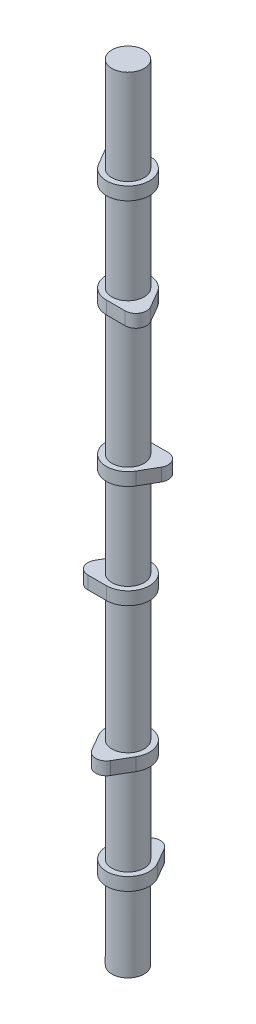
ISO-10303-21;
HEADER;
FILE_DESCRIPTION(('STEP AP214'),'2;1');
FILE_NAME('part.step','',(''),(''),'','','');
FILE_SCHEMA(('AUTOMOTIVE_DESIGN { 1 0 10303 214 1 1 1 1 }'));
ENDSEC;
DATA;
#1=APPLICATION_CONTEXT('core data for automotive mechanical design processes');
#2=APPLICATION_PROTOCOL_DEFINITION('international standard','automotive_design',2000,#1);
#3=PRODUCT_CONTEXT('',#1,'mechanical');
#4=PRODUCT('Part','Part','',(#3));
#5=PRODUCT_RELATED_PRODUCT_CATEGORY('part','',(#4));
#6=PRODUCT_DEFINITION_FORMATION('','',#4);
#7=PRODUCT_DEFINITION_CONTEXT('part definition',#1,'design');
#8=PRODUCT_DEFINITION('design','',#6,#7);
#9=PRODUCT_DEFINITION_SHAPE('','',#8);
#10=(LENGTH_UNIT() NAMED_UNIT(*) SI_UNIT(.MILLI.,.METRE.));
#11=(NAMED_UNIT(*) PLANE_ANGLE_UNIT() SI_UNIT($,.RADIAN.));
#12=(NAMED_UNIT(*) SI_UNIT($,.STERADIAN.) SOLID_ANGLE_UNIT());
#13=UNCERTAINTY_MEASURE_WITH_UNIT(LENGTH_MEASURE(1.E-05),#10,'distance_accuracy_value','');
#14=(GEOMETRIC_REPRESENTATION_CONTEXT(3) GLOBAL_UNCERTAINTY_ASSIGNED_CONTEXT((#13)) GLOBAL_UNIT_ASSIGNED_CONTEXT((#10,
#11,#12)) REPRESENTATION_CONTEXT('',''));
#15=CARTESIAN_POINT('',(0.,0.,0.));
#16=DIRECTION('',(0.,0.,1.));
#17=DIRECTION('',(1.,0.,0.));
#18=AXIS2_PLACEMENT_3D('',#15,#16,#17);
#19=CARTESIAN_POINT('',(-10.9985226280624,356.87,-6.34999999999997));
#20=DIRECTION('',(0.,-1.,0.));
#21=DIRECTION('',(-0.86602540378444,0.,-0.499999999999998));
#22=AXIS2_PLACEMENT_3D('',#19,#20,#21);
#23=CYLINDRICAL_SURFACE('',#22,6.35);
#24=CARTESIAN_POINT('',(-10.9985226280624,349.25,-6.34999999999997));
#25=DIRECTION('',(0.,1.,0.));
#26=DIRECTION('',(0.86602540378444,0.,0.499999999999998));
#27=AXIS2_PLACEMENT_3D('',#24,#25,#26);
#28=CIRCLE('',#27,6.35);
#29=CARTESIAN_POINT('',(-10.9985226280624,349.25,-12.7));
#30=VERTEX_POINT('',#29);
#31=CARTESIAN_POINT('',(-16.4977839420936,349.25,-3.17499999999996));
#32=VERTEX_POINT('',#31);
#33=EDGE_CURVE('E460',#30,#32,#28,.T.);
#34=ORIENTED_EDGE('',*,*,#33,.T.);
#35=DIRECTION('',(0.,-1.,0.));
#36=VECTOR('',#35,1.);
#37=CARTESIAN_POINT('',(-16.4977839420936,356.87,-3.17499999999996));
#38=LINE('',#37,#36);
#39=CARTESIAN_POINT('',(-16.4977839420936,356.87,-3.17499999999996));
#40=VERTEX_POINT('',#39);
#41=EDGE_CURVE('E490',#40,#32,#38,.T.);
#42=ORIENTED_EDGE('',*,*,#41,.F.);
#43=CARTESIAN_POINT('',(-10.9985226280624,356.87,-6.34999999999997));
#44=DIRECTION('',(0.,1.,0.));
#45=DIRECTION('',(0.86602540378444,0.,0.499999999999998));
#46=AXIS2_PLACEMENT_3D('',#43,#44,#45);
#47=CIRCLE('',#46,6.35);
#48=CARTESIAN_POINT('',(-10.9985226280624,356.87,-12.7));
#49=VERTEX_POINT('',#48);
#50=EDGE_CURVE('E461',#49,#40,#47,.T.);
#51=ORIENTED_EDGE('',*,*,#50,.F.);
#52=DIRECTION('',(0.,-1.,0.));
#53=VECTOR('',#52,1.);
#54=CARTESIAN_POINT('',(-10.9985226280624,356.87,-12.7));
#55=LINE('',#54,#53);
#56=EDGE_CURVE('E471',#49,#30,#55,.T.);
#57=ORIENTED_EDGE('',*,*,#56,.T.);
#58=EDGE_LOOP('',(#34,#42,#51,#57));
#59=FACE_BOUND('',#58,.T.);
#60=ADVANCED_FACE('F45',(#59),#23,.T.);
#61=CARTESIAN_POINT('',(-16.4977839420936,356.87,-3.17499999999996));
#62=DIRECTION('',(0.866025403784437,0.,-0.500000000000002));
#63=DIRECTION('',(-0.500000000000002,0.,-0.866025403784437));
#64=AXIS2_PLACEMENT_3D('',#61,#62,#63);
#65=PLANE('',#64);
#66=DIRECTION('',(0.500000000000002,0.,0.866025403784437));
#67=VECTOR('',#66,1.);
#68=CARTESIAN_POINT('',(-16.4977839420936,349.25,-3.17499999999996));
#69=LINE('',#68,#67);
#70=CARTESIAN_POINT('',(-10.9985226280624,349.25,6.35000000000002));
#71=VERTEX_POINT('',#70);
#72=EDGE_CURVE('E475',#32,#71,#69,.T.);
#73=ORIENTED_EDGE('',*,*,#72,.T.);
#74=DIRECTION('',(0.,-1.,0.));
#75=VECTOR('',#74,1.);
#76=CARTESIAN_POINT('',(-10.9985226280624,356.87,6.35000000000002));
#77=LINE('',#76,#75);
#78=CARTESIAN_POINT('',(-10.9985226280624,356.87,6.35000000000002));
#79=VERTEX_POINT('',#78);
#80=EDGE_CURVE('E487',#79,#71,#77,.T.);
#81=ORIENTED_EDGE('',*,*,#80,.F.);
#82=DIRECTION('',(0.500000000000002,0.,0.866025403784437));
#83=VECTOR('',#82,1.);
#84=CARTESIAN_POINT('',(-16.4977839420936,356.87,-3.17499999999996));
#85=LINE('',#84,#83);
#86=EDGE_CURVE('E95',#40,#79,#85,.T.);
#87=ORIENTED_EDGE('',*,*,#86,.F.);
#88=ORIENTED_EDGE('',*,*,#41,.T.);
#89=EDGE_LOOP('',(#73,#81,#87,#88));
#90=FACE_BOUND('',#89,.T.);
#91=ADVANCED_FACE('F511',(#90),#65,.F.);
#92=CARTESIAN_POINT('',(0.,356.87,0.));
#93=DIRECTION('',(0.,-1.,0.));
#94=DIRECTION('',(-0.86602540378444,0.,-0.499999999999998));
#95=AXIS2_PLACEMENT_3D('',#92,#93,#94);
#96=CYLINDRICAL_SURFACE('',#95,12.7);
#97=CARTESIAN_POINT('',(0.,349.25,0.));
#98=DIRECTION('',(0.,1.,0.));
#99=DIRECTION('',(0.86602540378444,0.,0.499999999999998));
#100=AXIS2_PLACEMENT_3D('',#97,#98,#99);
#101=CIRCLE('',#100,12.7);
#102=CARTESIAN_POINT('',(0.,349.25,-12.7));
#103=VERTEX_POINT('',#102);
#104=EDGE_CURVE('E81',#71,#103,#101,.T.);
#105=ORIENTED_EDGE('',*,*,#104,.T.);
#106=DIRECTION('',(0.,-1.,0.));
#107=VECTOR('',#106,1.);
#108=CARTESIAN_POINT('',(0.,356.87,-12.7));
#109=LINE('',#108,#107);
#110=CARTESIAN_POINT('',(0.,356.87,-12.7));
#111=VERTEX_POINT('',#110);
#112=EDGE_CURVE('E484',#111,#103,#109,.T.);
#113=ORIENTED_EDGE('',*,*,#112,.F.);
#114=CARTESIAN_POINT('',(0.,356.87,0.));
#115=DIRECTION('',(0.,1.,0.));
#116=DIRECTION('',(0.86602540378444,0.,0.499999999999998));
#117=AXIS2_PLACEMENT_3D('',#114,#115,#116);
#118=CIRCLE('',#117,12.7);
#119=EDGE_CURVE('E466',#79,#111,#118,.T.);
#120=ORIENTED_EDGE('',*,*,#119,.F.);
#121=ORIENTED_EDGE('',*,*,#80,.T.);
#122=EDGE_LOOP('',(#105,#113,#120,#121));
#123=FACE_BOUND('',#122,.T.);
#124=ADVANCED_FACE('F510',(#123),#96,.T.);
#125=CARTESIAN_POINT('',(-10.9985226280624,356.87,-12.7));
#126=DIRECTION('',(0.,0.,1.));
#127=DIRECTION('',(1.,0.,0.));
#128=AXIS2_PLACEMENT_3D('',#125,#126,#127);
#129=PLANE('',#128);
#130=DIRECTION('',(-1.,0.,0.));
#131=VECTOR('',#130,1.);
#132=CARTESIAN_POINT('',(-10.9985226280624,349.25,-12.7));
#133=LINE('',#132,#131);
#134=EDGE_CURVE('E87',#103,#30,#133,.T.);
#135=ORIENTED_EDGE('',*,*,#134,.T.);
#136=ORIENTED_EDGE('',*,*,#56,.F.);
#137=DIRECTION('',(-1.,0.,0.));
#138=VECTOR('',#137,1.);
#139=CARTESIAN_POINT('',(-10.9985226280624,356.87,-12.7));
#140=LINE('',#139,#138);
#141=EDGE_CURVE('E63',#111,#49,#140,.T.);
#142=ORIENTED_EDGE('',*,*,#141,.F.);
#143=ORIENTED_EDGE('',*,*,#112,.T.);
#144=EDGE_LOOP('',(#135,#136,#142,#143));
#145=FACE_BOUND('',#144,.T.);
#146=ADVANCED_FACE('F508',(#145),#129,.F.);
#147=CARTESIAN_POINT('',(-10.9985226280624,356.87,-6.34999999999997));
#148=DIRECTION('',(0.,1.,0.));
#149=DIRECTION('',(0.86602540378444,0.,0.499999999999998));
#150=AXIS2_PLACEMENT_3D('',#147,#148,#149);
#151=PLANE('',#150);
#152=CARTESIAN_POINT('',(0.,356.87,0.));
#153=DIRECTION('',(0.,1.,0.));
#154=DIRECTION('',(-0.866025403784443,0.,-0.499999999999992));
#155=AXIS2_PLACEMENT_3D('',#152,#153,#154);
#156=CIRCLE('',#155,9.5);
#157=CARTESIAN_POINT('',(-8.22724133595221,356.87,-4.74999999999992));
#158=VERTEX_POINT('',#157);
#159=EDGE_CURVE('E456',#158,#158,#156,.F.);
#160=ORIENTED_EDGE('',*,*,#159,.T.);
#161=EDGE_LOOP('',(#160));
#162=FACE_BOUND('',#161,.T.);
#163=ORIENTED_EDGE('',*,*,#50,.T.);
#164=ORIENTED_EDGE('',*,*,#86,.T.);
#165=ORIENTED_EDGE('',*,*,#119,.T.);
#166=ORIENTED_EDGE('',*,*,#141,.T.);
#167=EDGE_LOOP('',(#163,#164,#165,#166));
#168=FACE_BOUND('',#167,.T.);
#169=ADVANCED_FACE('F502',(#162,#168),#151,.T.);
#170=CARTESIAN_POINT('',(-10.9985226280624,349.25,-6.34999999999997));
#171=DIRECTION('',(0.,1.,0.));
#172=DIRECTION('',(0.86602540378444,0.,0.499999999999998));
#173=AXIS2_PLACEMENT_3D('',#170,#171,#172);
#174=PLANE('',#173);
#175=CARTESIAN_POINT('',(0.,349.25,0.));
#176=DIRECTION('',(0.,1.,0.));
#177=DIRECTION('',(-0.866025403784443,0.,-0.499999999999992));
#178=AXIS2_PLACEMENT_3D('',#175,#176,#177);
#179=CIRCLE('',#178,9.5);
#180=CARTESIAN_POINT('',(-8.22724133595221,349.25,-4.74999999999992));
#181=VERTEX_POINT('',#180);
#182=EDGE_CURVE('E55',#181,#181,#179,.F.);
#183=ORIENTED_EDGE('',*,*,#182,.F.);
#184=EDGE_LOOP('',(#183));
#185=FACE_BOUND('',#184,.T.);
#186=ORIENTED_EDGE('',*,*,#33,.F.);
#187=ORIENTED_EDGE('',*,*,#134,.F.);
#188=ORIENTED_EDGE('',*,*,#104,.F.);
#189=ORIENTED_EDGE('',*,*,#72,.F.);
#190=EDGE_LOOP('',(#186,#187,#188,#189));
#191=FACE_BOUND('',#190,.T.);
#192=ADVANCED_FACE('F499',(#185,#191),#174,.F.);
#193=CARTESIAN_POINT('',(0.,412.75,0.));
#194=DIRECTION('',(0.,-1.,0.));
#195=DIRECTION('',(0.866025403784443,0.,0.499999999999992));
#196=AXIS2_PLACEMENT_3D('',#193,#194,#195);
#197=CYLINDRICAL_SURFACE('',#196,9.5);
#198=CARTESIAN_POINT('',(0.,295.91,0.));
#199=DIRECTION('',(0.,1.,0.));
#200=DIRECTION('',(-0.866025403784443,0.,-0.499999999999992));
#201=AXIS2_PLACEMENT_3D('',#198,#199,#200);
#202=CIRCLE('',#201,9.5);
#203=CARTESIAN_POINT('',(-8.22724133595221,295.91,-4.74999999999992));
#204=VERTEX_POINT('',#203);
#205=EDGE_CURVE('E48',#204,#204,#202,.T.);
#206=ORIENTED_EDGE('',*,*,#205,.T.);
#207=EDGE_LOOP('',(#206));
#208=FACE_BOUND('',#207,.T.);
#209=ORIENTED_EDGE('',*,*,#182,.T.);
#210=EDGE_LOOP('',(#209));
#211=FACE_BOUND('',#210,.T.);
#212=ADVANCED_FACE('F497',(#208,#211),#197,.T.);
#213=ORIENTED_EDGE('',*,*,#159,.F.);
#214=EDGE_LOOP('',(#213));
#215=FACE_BOUND('',#214,.T.);
#216=CARTESIAN_POINT('',(0.,412.75,0.));
#217=DIRECTION('',(0.,1.,0.));
#218=DIRECTION('',(-0.866025403784443,0.,-0.499999999999992));
#219=AXIS2_PLACEMENT_3D('',#216,#217,#218);
#220=CIRCLE('',#219,9.5);
#221=CARTESIAN_POINT('',(-8.22724133595221,412.75,-4.74999999999992));
#222=VERTEX_POINT('',#221);
#223=EDGE_CURVE('E452',#222,#222,#220,.T.);
#224=ORIENTED_EDGE('',*,*,#223,.F.);
#225=EDGE_LOOP('',(#224));
#226=FACE_BOUND('',#225,.T.);
#227=ADVANCED_FACE('F524',(#215,#226),#197,.T.);
#228=CARTESIAN_POINT('',(0.,412.75,0.));
#229=DIRECTION('',(0.,1.,0.));
#230=DIRECTION('',(-0.866025403784443,0.,-0.499999999999992));
#231=AXIS2_PLACEMENT_3D('',#228,#229,#230);
#232=PLANE('',#231);
#233=ORIENTED_EDGE('',*,*,#223,.T.);
#234=EDGE_LOOP('',(#233));
#235=FACE_BOUND('',#234,.T.);
#236=ADVANCED_FACE('F527',(#235),#232,.T.);
#237=CARTESIAN_POINT('',(10.9985226280624,295.91,6.3499999999999));
#238=DIRECTION('',(0.,-1.,0.));
#239=DIRECTION('',(0.866025403784443,0.,0.499999999999992));
#240=AXIS2_PLACEMENT_3D('',#237,#238,#239);
#241=CYLINDRICAL_SURFACE('',#240,6.35);
#242=CARTESIAN_POINT('',(10.9985226280624,288.29,6.3499999999999));
#243=DIRECTION('',(0.,1.,0.));
#244=DIRECTION('',(-0.866025403784443,0.,-0.499999999999992));
#245=AXIS2_PLACEMENT_3D('',#242,#243,#244);
#246=CIRCLE('',#245,6.35);
#247=CARTESIAN_POINT('',(10.9985226280625,288.29,12.6999999999999));
#248=VERTEX_POINT('',#247);
#249=CARTESIAN_POINT('',(16.4977839420936,288.29,3.17499999999985));
#250=VERTEX_POINT('',#249);
#251=EDGE_CURVE('E407',#248,#250,#246,.T.);
#252=ORIENTED_EDGE('',*,*,#251,.T.);
#253=DIRECTION('',(0.,-1.,0.));
#254=VECTOR('',#253,1.);
#255=CARTESIAN_POINT('',(16.4977839420936,295.91,3.17499999999985));
#256=LINE('',#255,#254);
#257=CARTESIAN_POINT('',(16.4977839420936,295.91,3.17499999999985));
#258=VERTEX_POINT('',#257);
#259=EDGE_CURVE('E448',#258,#250,#256,.T.);
#260=ORIENTED_EDGE('',*,*,#259,.F.);
#261=CARTESIAN_POINT('',(10.9985226280624,295.91,6.3499999999999));
#262=DIRECTION('',(0.,1.,0.));
#263=DIRECTION('',(-0.866025403784443,0.,-0.499999999999992));
#264=AXIS2_PLACEMENT_3D('',#261,#262,#263);
#265=CIRCLE('',#264,6.35);
#266=CARTESIAN_POINT('',(10.9985226280625,295.91,12.6999999999999));
#267=VERTEX_POINT('',#266);
#268=EDGE_CURVE('E411',#267,#258,#265,.T.);
#269=ORIENTED_EDGE('',*,*,#268,.F.);
#270=DIRECTION('',(0.,-1.,0.));
#271=VECTOR('',#270,1.);
#272=CARTESIAN_POINT('',(10.9985226280625,295.91,12.6999999999999));
#273=LINE('',#272,#271);
#274=EDGE_CURVE('E425',#267,#248,#273,.T.);
#275=ORIENTED_EDGE('',*,*,#274,.T.);
#276=EDGE_LOOP('',(#252,#260,#269,#275));
#277=FACE_BOUND('',#276,.T.);
#278=ADVANCED_FACE('F532',(#277),#241,.T.);
#279=CARTESIAN_POINT('',(16.4977839420936,295.91,3.17499999999985));
#280=DIRECTION('',(-0.866025403784434,0.,0.500000000000008));
#281=DIRECTION('',(0.500000000000008,0.,0.866025403784434));
#282=AXIS2_PLACEMENT_3D('',#279,#280,#281);
#283=PLANE('',#282);
#284=DIRECTION('',(-0.500000000000008,0.,-0.866025403784434));
#285=VECTOR('',#284,1.);
#286=CARTESIAN_POINT('',(16.4977839420936,288.29,3.17499999999985));
#287=LINE('',#286,#285);
#288=CARTESIAN_POINT('',(10.9985226280623,288.29,-6.3500000000001));
#289=VERTEX_POINT('',#288);
#290=EDGE_CURVE('E429',#250,#289,#287,.T.);
#291=ORIENTED_EDGE('',*,*,#290,.T.);
#292=DIRECTION('',(0.,-1.,0.));
#293=VECTOR('',#292,1.);
#294=CARTESIAN_POINT('',(10.9985226280623,295.91,-6.3500000000001));
#295=LINE('',#294,#293);
#296=CARTESIAN_POINT('',(10.9985226280623,295.91,-6.3500000000001));
#297=VERTEX_POINT('',#296);
#298=EDGE_CURVE('E444',#297,#289,#295,.T.);
#299=ORIENTED_EDGE('',*,*,#298,.F.);
#300=DIRECTION('',(-0.500000000000008,0.,-0.866025403784434));
#301=VECTOR('',#300,1.);
#302=CARTESIAN_POINT('',(16.4977839420936,295.91,3.17499999999985));
#303=LINE('',#302,#301);
#304=EDGE_CURVE('E415',#258,#297,#303,.T.);
#305=ORIENTED_EDGE('',*,*,#304,.F.);
#306=ORIENTED_EDGE('',*,*,#259,.T.);
#307=EDGE_LOOP('',(#291,#299,#305,#306));
#308=FACE_BOUND('',#307,.T.);
#309=ADVANCED_FACE('F536',(#308),#283,.F.);
#310=CARTESIAN_POINT('',(0.,295.91,0.));
#311=DIRECTION('',(0.,-1.,0.));
#312=DIRECTION('',(0.866025403784443,0.,0.499999999999992));
#313=AXIS2_PLACEMENT_3D('',#310,#311,#312);
#314=CYLINDRICAL_SURFACE('',#313,12.7);
#315=CARTESIAN_POINT('',(0.,288.29,0.));
#316=DIRECTION('',(0.,1.,0.));
#317=DIRECTION('',(-0.866025403784443,0.,-0.499999999999992));
#318=AXIS2_PLACEMENT_3D('',#315,#316,#317);
#319=CIRCLE('',#318,12.7);
#320=CARTESIAN_POINT('',(1.32706345912226E-13,288.29,12.7));
#321=VERTEX_POINT('',#320);
#322=EDGE_CURVE('E432',#289,#321,#319,.T.);
#323=ORIENTED_EDGE('',*,*,#322,.T.);
#324=DIRECTION('',(0.,-1.,0.));
#325=VECTOR('',#324,1.);
#326=CARTESIAN_POINT('',(1.32706345912226E-13,295.91,12.7));
#327=LINE('',#326,#325);
#328=CARTESIAN_POINT('',(1.32706345912226E-13,295.91,12.7));
#329=VERTEX_POINT('',#328);
#330=EDGE_CURVE('E440',#329,#321,#327,.T.);
#331=ORIENTED_EDGE('',*,*,#330,.F.);
#332=CARTESIAN_POINT('',(0.,295.91,0.));
#333=DIRECTION('',(0.,1.,0.));
#334=DIRECTION('',(-0.866025403784443,0.,-0.499999999999992));
#335=AXIS2_PLACEMENT_3D('',#332,#333,#334);
#336=CIRCLE('',#335,12.7);
#337=EDGE_CURVE('E419',#297,#329,#336,.T.);
#338=ORIENTED_EDGE('',*,*,#337,.F.);
#339=ORIENTED_EDGE('',*,*,#298,.T.);
#340=EDGE_LOOP('',(#323,#331,#338,#339));
#341=FACE_BOUND('',#340,.T.);
#342=ADVANCED_FACE('F540',(#341),#314,.T.);
#343=CARTESIAN_POINT('',(10.9985226280625,295.91,12.6999999999999));
#344=DIRECTION('',(0.,0.,-1.));
#345=DIRECTION('',(-1.,0.,0.));
#346=AXIS2_PLACEMENT_3D('',#343,#344,#345);
#347=PLANE('',#346);
#348=DIRECTION('',(1.,0.,0.));
#349=VECTOR('',#348,1.);
#350=CARTESIAN_POINT('',(10.9985226280625,288.29,12.6999999999999));
#351=LINE('',#350,#349);
#352=EDGE_CURVE('E416',#321,#248,#351,.T.);
#353=ORIENTED_EDGE('',*,*,#352,.T.);
#354=ORIENTED_EDGE('',*,*,#274,.F.);
#355=DIRECTION('',(1.,0.,0.));
#356=VECTOR('',#355,1.);
#357=CARTESIAN_POINT('',(10.9985226280625,295.91,12.6999999999999));
#358=LINE('',#357,#356);
#359=EDGE_CURVE('E422',#329,#267,#358,.T.);
#360=ORIENTED_EDGE('',*,*,#359,.F.);
#361=ORIENTED_EDGE('',*,*,#330,.T.);
#362=EDGE_LOOP('',(#353,#354,#360,#361));
#363=FACE_BOUND('',#362,.T.);
#364=ADVANCED_FACE('F544',(#363),#347,.F.);
#365=CARTESIAN_POINT('',(10.9985226280624,295.91,6.3499999999999));
#366=DIRECTION('',(0.,1.,0.));
#367=DIRECTION('',(-0.866025403784443,0.,-0.499999999999992));
#368=AXIS2_PLACEMENT_3D('',#365,#366,#367);
#369=PLANE('',#368);
#370=ORIENTED_EDGE('',*,*,#205,.F.);
#371=EDGE_LOOP('',(#370));
#372=FACE_BOUND('',#371,.T.);
#373=ORIENTED_EDGE('',*,*,#268,.T.);
#374=ORIENTED_EDGE('',*,*,#304,.T.);
#375=ORIENTED_EDGE('',*,*,#337,.T.);
#376=ORIENTED_EDGE('',*,*,#359,.T.);
#377=EDGE_LOOP('',(#373,#374,#375,#376));
#378=FACE_BOUND('',#377,.T.);
#379=ADVANCED_FACE('F548',(#372,#378),#369,.T.);
#380=CARTESIAN_POINT('',(10.9985226280624,288.29,6.3499999999999));
#381=DIRECTION('',(0.,1.,0.));
#382=DIRECTION('',(-0.866025403784443,0.,-0.499999999999992));
#383=AXIS2_PLACEMENT_3D('',#380,#381,#382);
#384=PLANE('',#383);
#385=CARTESIAN_POINT('',(0.,288.29,0.));
#386=DIRECTION('',(0.,1.,0.));
#387=DIRECTION('',(-0.866025403784443,0.,-0.499999999999992));
#388=AXIS2_PLACEMENT_3D('',#385,#386,#387);
#389=CIRCLE('',#388,9.5);
#390=CARTESIAN_POINT('',(-8.22724133595221,288.29,-4.74999999999992));
#391=VERTEX_POINT('',#390);
#392=EDGE_CURVE('E11',#391,#391,#389,.T.);
#393=ORIENTED_EDGE('',*,*,#392,.T.);
#394=EDGE_LOOP('',(#393));
#395=FACE_BOUND('',#394,.T.);
#396=ORIENTED_EDGE('',*,*,#251,.F.);
#397=ORIENTED_EDGE('',*,*,#352,.F.);
#398=ORIENTED_EDGE('',*,*,#322,.F.);
#399=ORIENTED_EDGE('',*,*,#290,.F.);
#400=EDGE_LOOP('',(#396,#397,#398,#399));
#401=FACE_BOUND('',#400,.T.);
#402=ADVANCED_FACE('F550',(#395,#401),#384,.F.);
#403=ORIENTED_EDGE('',*,*,#392,.F.);
#404=EDGE_LOOP('',(#403));
#405=FACE_BOUND('',#404,.T.);
#406=CARTESIAN_POINT('',(0.,210.82,0.));
#407=DIRECTION('',(0.,1.,0.));
#408=DIRECTION('',(0.866025403784436,0.,-0.500000000000004));
#409=AXIS2_PLACEMENT_3D('',#406,#407,#408);
#410=CIRCLE('',#409,9.5);
#411=CARTESIAN_POINT('',(8.22724133595215,210.82,-4.75000000000004));
#412=VERTEX_POINT('',#411);
#413=EDGE_CURVE('E353',#412,#412,#410,.F.);
#414=ORIENTED_EDGE('',*,*,#413,.F.);
#415=EDGE_LOOP('',(#414));
#416=FACE_BOUND('',#415,.T.);
#417=ADVANCED_FACE('F529',(#405,#416),#197,.T.);
#418=CARTESIAN_POINT('',(10.9985226280624,210.82,-6.34999999999997));
#419=DIRECTION('',(0.,-1.,0.));
#420=DIRECTION('',(0.86602540378444,0.,-0.499999999999998));
#421=AXIS2_PLACEMENT_3D('',#418,#419,#420);
#422=CYLINDRICAL_SURFACE('',#421,6.35);
#423=CARTESIAN_POINT('',(10.9985226280624,203.2,-6.34999999999997));
#424=DIRECTION('',(0.,1.,0.));
#425=DIRECTION('',(-0.86602540378444,0.,0.499999999999998));
#426=AXIS2_PLACEMENT_3D('',#423,#424,#425);
#427=CIRCLE('',#426,6.35);
#428=CARTESIAN_POINT('',(16.4977839420936,203.2,-3.17499999999996));
#429=VERTEX_POINT('',#428);
#430=CARTESIAN_POINT('',(10.9985226280624,203.2,-12.7));
#431=VERTEX_POINT('',#430);
#432=EDGE_CURVE('E357',#429,#431,#427,.T.);
#433=ORIENTED_EDGE('',*,*,#432,.T.);
#434=DIRECTION('',(0.,-1.,0.));
#435=VECTOR('',#434,1.);
#436=CARTESIAN_POINT('',(10.9985226280624,210.82,-12.7));
#437=LINE('',#436,#435);
#438=CARTESIAN_POINT('',(10.9985226280624,210.82,-12.7));
#439=VERTEX_POINT('',#438);
#440=EDGE_CURVE('E395',#439,#431,#437,.T.);
#441=ORIENTED_EDGE('',*,*,#440,.F.);
#442=CARTESIAN_POINT('',(10.9985226280624,210.82,-6.34999999999997));
#443=DIRECTION('',(0.,1.,0.));
#444=DIRECTION('',(-0.86602540378444,0.,0.499999999999998));
#445=AXIS2_PLACEMENT_3D('',#442,#443,#444);
#446=CIRCLE('',#445,6.35);
#447=CARTESIAN_POINT('',(16.4977839420936,210.82,-3.17499999999996));
#448=VERTEX_POINT('',#447);
#449=EDGE_CURVE('E358',#448,#439,#446,.T.);
#450=ORIENTED_EDGE('',*,*,#449,.F.);
#451=DIRECTION('',(0.,-1.,0.));
#452=VECTOR('',#451,1.);
#453=CARTESIAN_POINT('',(16.4977839420936,210.82,-3.17499999999996));
#454=LINE('',#453,#452);
#455=EDGE_CURVE('E372',#448,#429,#454,.T.);
#456=ORIENTED_EDGE('',*,*,#455,.T.);
#457=EDGE_LOOP('',(#433,#441,#450,#456));
#458=FACE_BOUND('',#457,.T.);
#459=ADVANCED_FACE('F557',(#458),#422,.T.);
#460=CARTESIAN_POINT('',(10.9985226280624,210.82,-12.7));
#461=DIRECTION('',(0.,0.,1.));
#462=DIRECTION('',(1.,0.,0.));
#463=AXIS2_PLACEMENT_3D('',#460,#461,#462);
#464=PLANE('',#463);
#465=DIRECTION('',(-1.,0.,0.));
#466=VECTOR('',#465,1.);
#467=CARTESIAN_POINT('',(10.9985226280624,203.2,-12.7));
#468=LINE('',#467,#466);
#469=CARTESIAN_POINT('',(0.,203.2,-12.7));
#470=VERTEX_POINT('',#469);
#471=EDGE_CURVE('E376',#431,#470,#468,.T.);
#472=ORIENTED_EDGE('',*,*,#471,.T.);
#473=DIRECTION('',(0.,-1.,0.));
#474=VECTOR('',#473,1.);
#475=CARTESIAN_POINT('',(0.,210.82,-12.7));
#476=LINE('',#475,#474);
#477=CARTESIAN_POINT('',(0.,210.82,-12.7));
#478=VERTEX_POINT('',#477);
#479=EDGE_CURVE('E391',#478,#470,#476,.T.);
#480=ORIENTED_EDGE('',*,*,#479,.F.);
#481=DIRECTION('',(-1.,0.,0.));
#482=VECTOR('',#481,1.);
#483=CARTESIAN_POINT('',(10.9985226280624,210.82,-12.7));
#484=LINE('',#483,#482);
#485=EDGE_CURVE('E362',#439,#478,#484,.T.);
#486=ORIENTED_EDGE('',*,*,#485,.F.);
#487=ORIENTED_EDGE('',*,*,#440,.T.);
#488=EDGE_LOOP('',(#472,#480,#486,#487));
#489=FACE_BOUND('',#488,.T.);
#490=ADVANCED_FACE('F560',(#489),#464,.F.);
#491=CARTESIAN_POINT('',(0.,210.82,0.));
#492=DIRECTION('',(0.,-1.,0.));
#493=DIRECTION('',(0.86602540378444,0.,-0.499999999999998));
#494=AXIS2_PLACEMENT_3D('',#491,#492,#493);
#495=CYLINDRICAL_SURFACE('',#494,12.7);
#496=CARTESIAN_POINT('',(0.,203.2,0.));
#497=DIRECTION('',(0.,1.,0.));
#498=DIRECTION('',(-0.86602540378444,0.,0.499999999999998));
#499=AXIS2_PLACEMENT_3D('',#496,#497,#498);
#500=CIRCLE('',#499,12.7);
#501=CARTESIAN_POINT('',(10.9985226280624,203.2,6.35000000000001));
#502=VERTEX_POINT('',#501);
#503=EDGE_CURVE('E379',#470,#502,#500,.T.);
#504=ORIENTED_EDGE('',*,*,#503,.T.);
#505=DIRECTION('',(0.,-1.,0.));
#506=VECTOR('',#505,1.);
#507=CARTESIAN_POINT('',(10.9985226280624,210.82,6.35000000000001));
#508=LINE('',#507,#506);
#509=CARTESIAN_POINT('',(10.9985226280624,210.82,6.35000000000001));
#510=VERTEX_POINT('',#509);
#511=EDGE_CURVE('E387',#510,#502,#508,.T.);
#512=ORIENTED_EDGE('',*,*,#511,.F.);
#513=CARTESIAN_POINT('',(0.,210.82,0.));
#514=DIRECTION('',(0.,1.,0.));
#515=DIRECTION('',(-0.86602540378444,0.,0.499999999999998));
#516=AXIS2_PLACEMENT_3D('',#513,#514,#515);
#517=CIRCLE('',#516,12.7);
#518=EDGE_CURVE('E366',#478,#510,#517,.T.);
#519=ORIENTED_EDGE('',*,*,#518,.F.);
#520=ORIENTED_EDGE('',*,*,#479,.T.);
#521=EDGE_LOOP('',(#504,#512,#519,#520));
#522=FACE_BOUND('',#521,.T.);
#523=ADVANCED_FACE('F564',(#522),#495,.T.);
#524=CARTESIAN_POINT('',(16.4977839420936,210.82,-3.17499999999996));
#525=DIRECTION('',(-0.866025403784438,0.,-0.500000000000002));
#526=DIRECTION('',(-0.500000000000002,0.,0.866025403784438));
#527=AXIS2_PLACEMENT_3D('',#524,#525,#526);
#528=PLANE('',#527);
#529=DIRECTION('',(0.500000000000002,0.,-0.866025403784438));
#530=VECTOR('',#529,1.);
#531=CARTESIAN_POINT('',(16.4977839420936,203.2,-3.17499999999996));
#532=LINE('',#531,#530);
#533=EDGE_CURVE('E363',#502,#429,#532,.T.);
#534=ORIENTED_EDGE('',*,*,#533,.T.);
#535=ORIENTED_EDGE('',*,*,#455,.F.);
#536=DIRECTION('',(0.500000000000002,0.,-0.866025403784438));
#537=VECTOR('',#536,1.);
#538=CARTESIAN_POINT('',(16.4977839420936,210.82,-3.17499999999996));
#539=LINE('',#538,#537);
#540=EDGE_CURVE('E369',#510,#448,#539,.T.);
#541=ORIENTED_EDGE('',*,*,#540,.F.);
#542=ORIENTED_EDGE('',*,*,#511,.T.);
#543=EDGE_LOOP('',(#534,#535,#541,#542));
#544=FACE_BOUND('',#543,.T.);
#545=ADVANCED_FACE('F568',(#544),#528,.F.);
#546=CARTESIAN_POINT('',(10.9985226280624,210.82,-6.34999999999997));
#547=DIRECTION('',(0.,1.,0.));
#548=DIRECTION('',(-0.86602540378444,0.,0.499999999999998));
#549=AXIS2_PLACEMENT_3D('',#546,#547,#548);
#550=PLANE('',#549);
#551=ORIENTED_EDGE('',*,*,#413,.T.);
#552=EDGE_LOOP('',(#551));
#553=FACE_BOUND('',#552,.T.);
#554=ORIENTED_EDGE('',*,*,#449,.T.);
#555=ORIENTED_EDGE('',*,*,#485,.T.);
#556=ORIENTED_EDGE('',*,*,#518,.T.);
#557=ORIENTED_EDGE('',*,*,#540,.T.);
#558=EDGE_LOOP('',(#554,#555,#556,#557));
#559=FACE_BOUND('',#558,.T.);
#560=ADVANCED_FACE('F572',(#553,#559),#550,.T.);
#561=CARTESIAN_POINT('',(10.9985226280624,203.2,-6.34999999999997));
#562=DIRECTION('',(0.,1.,0.));
#563=DIRECTION('',(-0.86602540378444,0.,0.499999999999998));
#564=AXIS2_PLACEMENT_3D('',#561,#562,#563);
#565=PLANE('',#564);
#566=CARTESIAN_POINT('',(0.,203.2,0.));
#567=DIRECTION('',(0.,1.,0.));
#568=DIRECTION('',(0.866025403784436,0.,-0.500000000000004));
#569=AXIS2_PLACEMENT_3D('',#566,#567,#568);
#570=CIRCLE('',#569,9.5);
#571=CARTESIAN_POINT('',(8.22724133595215,203.2,-4.75000000000004));
#572=VERTEX_POINT('',#571);
#573=EDGE_CURVE('E399',#572,#572,#570,.F.);
#574=ORIENTED_EDGE('',*,*,#573,.F.);
#575=EDGE_LOOP('',(#574));
#576=FACE_BOUND('',#575,.T.);
#577=ORIENTED_EDGE('',*,*,#432,.F.);
#578=ORIENTED_EDGE('',*,*,#533,.F.);
#579=ORIENTED_EDGE('',*,*,#503,.F.);
#580=ORIENTED_EDGE('',*,*,#471,.F.);
#581=EDGE_LOOP('',(#577,#578,#579,#580));
#582=FACE_BOUND('',#581,.T.);
#583=ADVANCED_FACE('F574',(#576,#582),#565,.F.);
#584=CARTESIAN_POINT('',(0.,266.7,0.));
#585=DIRECTION('',(0.,-1.,0.));
#586=DIRECTION('',(-0.866025403784436,0.,0.500000000000004));
#587=AXIS2_PLACEMENT_3D('',#584,#585,#586);
#588=CYLINDRICAL_SURFACE('',#587,9.5);
#589=CARTESIAN_POINT('',(0.,149.86,0.));
#590=DIRECTION('',(0.,1.,0.));
#591=DIRECTION('',(0.866025403784436,0.,-0.500000000000004));
#592=AXIS2_PLACEMENT_3D('',#589,#590,#591);
#593=CIRCLE('',#592,9.5);
#594=CARTESIAN_POINT('',(8.22724133595215,149.86,-4.75000000000004));
#595=VERTEX_POINT('',#594);
#596=EDGE_CURVE('E352',#595,#595,#593,.T.);
#597=ORIENTED_EDGE('',*,*,#596,.T.);
#598=EDGE_LOOP('',(#597));
#599=FACE_BOUND('',#598,.T.);
#600=ORIENTED_EDGE('',*,*,#573,.T.);
#601=EDGE_LOOP('',(#600));
#602=FACE_BOUND('',#601,.T.);
#603=ADVANCED_FACE('F577',(#599,#602),#588,.T.);
#604=CARTESIAN_POINT('',(-10.9985226280623,149.86,6.35000000000005));
#605=DIRECTION('',(0.,-1.,0.));
#606=DIRECTION('',(-0.866025403784436,0.,0.500000000000004));
#607=AXIS2_PLACEMENT_3D('',#604,#605,#606);
#608=CYLINDRICAL_SURFACE('',#607,6.35);
#609=CARTESIAN_POINT('',(-10.9985226280623,142.24,6.35000000000005));
#610=DIRECTION('',(0.,1.,0.));
#611=DIRECTION('',(0.866025403784436,0.,-0.500000000000004));
#612=AXIS2_PLACEMENT_3D('',#609,#610,#611);
#613=CIRCLE('',#612,6.35);
#614=CARTESIAN_POINT('',(-16.4977839420935,142.24,3.17500000000008));
#615=VERTEX_POINT('',#614);
#616=CARTESIAN_POINT('',(-10.9985226280623,142.24,12.7000000000001));
#617=VERTEX_POINT('',#616);
#618=EDGE_CURVE('E309',#615,#617,#613,.T.);
#619=ORIENTED_EDGE('',*,*,#618,.T.);
#620=DIRECTION('',(0.,-1.,0.));
#621=VECTOR('',#620,1.);
#622=CARTESIAN_POINT('',(-10.9985226280623,149.86,12.7000000000001));
#623=LINE('',#622,#621);
#624=CARTESIAN_POINT('',(-10.9985226280623,149.86,12.7000000000001));
#625=VERTEX_POINT('',#624);
#626=EDGE_CURVE('E348',#625,#617,#623,.T.);
#627=ORIENTED_EDGE('',*,*,#626,.F.);
#628=CARTESIAN_POINT('',(-10.9985226280623,149.86,6.35000000000005));
#629=DIRECTION('',(0.,1.,0.));
#630=DIRECTION('',(0.866025403784436,0.,-0.500000000000004));
#631=AXIS2_PLACEMENT_3D('',#628,#629,#630);
#632=CIRCLE('',#631,6.35);
#633=CARTESIAN_POINT('',(-16.4977839420935,149.86,3.17500000000008));
#634=VERTEX_POINT('',#633);
#635=EDGE_CURVE('E311',#634,#625,#632,.T.);
#636=ORIENTED_EDGE('',*,*,#635,.F.);
#637=DIRECTION('',(0.,-1.,0.));
#638=VECTOR('',#637,1.);
#639=CARTESIAN_POINT('',(-16.4977839420935,149.86,3.17500000000008));
#640=LINE('',#639,#638);
#641=EDGE_CURVE('E325',#634,#615,#640,.T.);
#642=ORIENTED_EDGE('',*,*,#641,.T.);
#643=EDGE_LOOP('',(#619,#627,#636,#642));
#644=FACE_BOUND('',#643,.T.);
#645=ADVANCED_FACE('F588',(#644),#608,.T.);
#646=CARTESIAN_POINT('',(-10.9985226280623,149.86,12.7000000000001));
#647=DIRECTION('',(0.,0.,-1.));
#648=DIRECTION('',(-1.,0.,0.));
#649=AXIS2_PLACEMENT_3D('',#646,#647,#648);
#650=PLANE('',#649);
#651=DIRECTION('',(1.,0.,0.));
#652=VECTOR('',#651,1.);
#653=CARTESIAN_POINT('',(-10.9985226280623,142.24,12.7000000000001));
#654=LINE('',#653,#652);
#655=CARTESIAN_POINT('',(0.,142.24,12.7));
#656=VERTEX_POINT('',#655);
#657=EDGE_CURVE('E329',#617,#656,#654,.T.);
#658=ORIENTED_EDGE('',*,*,#657,.T.);
#659=DIRECTION('',(0.,-1.,0.));
#660=VECTOR('',#659,1.);
#661=CARTESIAN_POINT('',(0.,149.86,12.7));
#662=LINE('',#661,#660);
#663=CARTESIAN_POINT('',(0.,149.86,12.7));
#664=VERTEX_POINT('',#663);
#665=EDGE_CURVE('E344',#664,#656,#662,.T.);
#666=ORIENTED_EDGE('',*,*,#665,.F.);
#667=DIRECTION('',(1.,0.,0.));
#668=VECTOR('',#667,1.);
#669=CARTESIAN_POINT('',(-10.9985226280623,149.86,12.7000000000001));
#670=LINE('',#669,#668);
#671=EDGE_CURVE('E315',#625,#664,#670,.T.);
#672=ORIENTED_EDGE('',*,*,#671,.F.);
#673=ORIENTED_EDGE('',*,*,#626,.T.);
#674=EDGE_LOOP('',(#658,#666,#672,#673));
#675=FACE_BOUND('',#674,.T.);
#676=ADVANCED_FACE('F591',(#675),#650,.F.);
#677=CARTESIAN_POINT('',(0.,149.86,0.));
#678=DIRECTION('',(0.,-1.,0.));
#679=DIRECTION('',(-0.866025403784436,0.,0.500000000000004));
#680=AXIS2_PLACEMENT_3D('',#677,#678,#679);
#681=CYLINDRICAL_SURFACE('',#680,12.7);
#682=CARTESIAN_POINT('',(0.,142.24,0.));
#683=DIRECTION('',(0.,1.,0.));
#684=DIRECTION('',(0.866025403784436,0.,-0.500000000000004));
#685=AXIS2_PLACEMENT_3D('',#682,#683,#684);
#686=CIRCLE('',#685,12.7);
#687=CARTESIAN_POINT('',(-10.9985226280624,142.24,-6.34999999999994));
#688=VERTEX_POINT('',#687);
#689=EDGE_CURVE('E332',#656,#688,#686,.T.);
#690=ORIENTED_EDGE('',*,*,#689,.T.);
#691=DIRECTION('',(0.,-1.,0.));
#692=VECTOR('',#691,1.);
#693=CARTESIAN_POINT('',(-10.9985226280624,149.86,-6.34999999999994));
#694=LINE('',#693,#692);
#695=CARTESIAN_POINT('',(-10.9985226280624,149.86,-6.34999999999994));
#696=VERTEX_POINT('',#695);
#697=EDGE_CURVE('E340',#696,#688,#694,.T.);
#698=ORIENTED_EDGE('',*,*,#697,.F.);
#699=CARTESIAN_POINT('',(0.,149.86,0.));
#700=DIRECTION('',(0.,1.,0.));
#701=DIRECTION('',(0.866025403784436,0.,-0.500000000000004));
#702=AXIS2_PLACEMENT_3D('',#699,#700,#701);
#703=CIRCLE('',#702,12.7);
#704=EDGE_CURVE('E319',#664,#696,#703,.T.);
#705=ORIENTED_EDGE('',*,*,#704,.F.);
#706=ORIENTED_EDGE('',*,*,#665,.T.);
#707=EDGE_LOOP('',(#690,#698,#705,#706));
#708=FACE_BOUND('',#707,.T.);
#709=ADVANCED_FACE('F595',(#708),#681,.T.);
#710=CARTESIAN_POINT('',(-16.4977839420935,149.86,3.17500000000008));
#711=DIRECTION('',(0.866025403784441,0.,0.499999999999996));
#712=DIRECTION('',(0.499999999999996,0.,-0.866025403784441));
#713=AXIS2_PLACEMENT_3D('',#710,#711,#712);
#714=PLANE('',#713);
#715=DIRECTION('',(-0.499999999999996,0.,0.866025403784441));
#716=VECTOR('',#715,1.);
#717=CARTESIAN_POINT('',(-16.4977839420935,142.24,3.17500000000008));
#718=LINE('',#717,#716);
#719=EDGE_CURVE('E316',#688,#615,#718,.T.);
#720=ORIENTED_EDGE('',*,*,#719,.T.);
#721=ORIENTED_EDGE('',*,*,#641,.F.);
#722=DIRECTION('',(-0.499999999999996,0.,0.866025403784441));
#723=VECTOR('',#722,1.);
#724=CARTESIAN_POINT('',(-16.4977839420935,149.86,3.17500000000008));
#725=LINE('',#724,#723);
#726=EDGE_CURVE('E322',#696,#634,#725,.T.);
#727=ORIENTED_EDGE('',*,*,#726,.F.);
#728=ORIENTED_EDGE('',*,*,#697,.T.);
#729=EDGE_LOOP('',(#720,#721,#727,#728));
#730=FACE_BOUND('',#729,.T.);
#731=ADVANCED_FACE('F599',(#730),#714,.F.);
#732=CARTESIAN_POINT('',(-10.9985226280623,149.86,6.35000000000005));
#733=DIRECTION('',(0.,1.,0.));
#734=DIRECTION('',(0.866025403784436,0.,-0.500000000000004));
#735=AXIS2_PLACEMENT_3D('',#732,#733,#734);
#736=PLANE('',#735);
#737=ORIENTED_EDGE('',*,*,#596,.F.);
#738=EDGE_LOOP('',(#737));
#739=FACE_BOUND('',#738,.T.);
#740=ORIENTED_EDGE('',*,*,#635,.T.);
#741=ORIENTED_EDGE('',*,*,#671,.T.);
#742=ORIENTED_EDGE('',*,*,#704,.T.);
#743=ORIENTED_EDGE('',*,*,#726,.T.);
#744=EDGE_LOOP('',(#740,#741,#742,#743));
#745=FACE_BOUND('',#744,.T.);
#746=ADVANCED_FACE('F603',(#739,#745),#736,.T.);
#747=CARTESIAN_POINT('',(-10.9985226280623,142.24,6.35000000000005));
#748=DIRECTION('',(0.,1.,0.));
#749=DIRECTION('',(0.866025403784436,0.,-0.500000000000004));
#750=AXIS2_PLACEMENT_3D('',#747,#748,#749);
#751=PLANE('',#750);
#752=CARTESIAN_POINT('',(0.,142.24,0.));
#753=DIRECTION('',(0.,1.,0.));
#754=DIRECTION('',(0.866025403784436,0.,-0.500000000000004));
#755=AXIS2_PLACEMENT_3D('',#752,#753,#754);
#756=CIRCLE('',#755,9.5);
#757=CARTESIAN_POINT('',(8.22724133595215,142.24,-4.75000000000004));
#758=VERTEX_POINT('',#757);
#759=EDGE_CURVE('E403',#758,#758,#756,.T.);
#760=ORIENTED_EDGE('',*,*,#759,.T.);
#761=EDGE_LOOP('',(#760));
#762=FACE_BOUND('',#761,.T.);
#763=ORIENTED_EDGE('',*,*,#618,.F.);
#764=ORIENTED_EDGE('',*,*,#719,.F.);
#765=ORIENTED_EDGE('',*,*,#689,.F.);
#766=ORIENTED_EDGE('',*,*,#657,.F.);
#767=EDGE_LOOP('',(#763,#764,#765,#766));
#768=FACE_BOUND('',#767,.T.);
#769=ADVANCED_FACE('F586',(#762,#768),#751,.F.);
#770=ORIENTED_EDGE('',*,*,#759,.F.);
#771=EDGE_LOOP('',(#770));
#772=FACE_BOUND('',#771,.T.);
#773=CARTESIAN_POINT('',(0.,64.77,0.));
#774=DIRECTION('',(0.,1.,0.));
#775=DIRECTION('',(0.,0.,1.));
#776=AXIS2_PLACEMENT_3D('',#773,#774,#775);
#777=CIRCLE('',#776,9.5);
#778=CARTESIAN_POINT('',(0.,64.77,9.5));
#779=VERTEX_POINT('',#778);
#780=EDGE_CURVE('E251',#779,#779,#777,.F.);
#781=ORIENTED_EDGE('',*,*,#780,.F.);
#782=EDGE_LOOP('',(#781));
#783=FACE_BOUND('',#782,.T.);
#784=ADVANCED_FACE('F582',(#772,#783),#588,.T.);
#785=CARTESIAN_POINT('',(0.,64.77,12.7));
#786=DIRECTION('',(0.,-1.,0.));
#787=DIRECTION('',(0.,0.,1.));
#788=AXIS2_PLACEMENT_3D('',#785,#786,#787);
#789=CYLINDRICAL_SURFACE('',#788,6.35);
#790=CARTESIAN_POINT('',(0.,57.15,12.7));
#791=DIRECTION('',(0.,1.,0.));
#792=DIRECTION('',(0.,0.,-1.));
#793=AXIS2_PLACEMENT_3D('',#790,#791,#792);
#794=CIRCLE('',#793,6.35);
#795=CARTESIAN_POINT('',(-5.49926131403129,57.15,15.875));
#796=VERTEX_POINT('',#795);
#797=CARTESIAN_POINT('',(5.49926131403107,57.15,15.875));
#798=VERTEX_POINT('',#797);
#799=EDGE_CURVE('E260',#796,#798,#794,.T.);
#800=ORIENTED_EDGE('',*,*,#799,.T.);
#801=DIRECTION('',(0.,-1.,0.));
#802=VECTOR('',#801,1.);
#803=CARTESIAN_POINT('',(5.49926131403107,64.77,15.875));
#804=LINE('',#803,#802);
#805=CARTESIAN_POINT('',(5.49926131403107,64.77,15.875));
#806=VERTEX_POINT('',#805);
#807=EDGE_CURVE('E298',#806,#798,#804,.T.);
#808=ORIENTED_EDGE('',*,*,#807,.F.);
#809=CARTESIAN_POINT('',(0.,64.77,12.7));
#810=DIRECTION('',(0.,1.,0.));
#811=DIRECTION('',(0.,0.,-1.));
#812=AXIS2_PLACEMENT_3D('',#809,#810,#811);
#813=CIRCLE('',#812,6.35);
#814=CARTESIAN_POINT('',(-5.49926131403129,64.77,15.875));
#815=VERTEX_POINT('',#814);
#816=EDGE_CURVE('E261',#815,#806,#813,.T.);
#817=ORIENTED_EDGE('',*,*,#816,.F.);
#818=DIRECTION('',(0.,-1.,0.));
#819=VECTOR('',#818,1.);
#820=CARTESIAN_POINT('',(-5.49926131403129,64.77,15.875));
#821=LINE('',#820,#819);
#822=EDGE_CURVE('E275',#815,#796,#821,.T.);
#823=ORIENTED_EDGE('',*,*,#822,.T.);
#824=EDGE_LOOP('',(#800,#808,#817,#823));
#825=FACE_BOUND('',#824,.T.);
#826=ADVANCED_FACE('F585',(#825),#789,.T.);
#827=CARTESIAN_POINT('',(5.49926131403107,64.77,15.875));
#828=DIRECTION('',(-0.866025403784435,0.,-0.500000000000006));
#829=DIRECTION('',(-0.500000000000006,0.,0.866025403784435));
#830=AXIS2_PLACEMENT_3D('',#827,#828,#829);
#831=PLANE('',#830);
#832=DIRECTION('',(0.500000000000006,0.,-0.866025403784435));
#833=VECTOR('',#832,1.);
#834=CARTESIAN_POINT('',(5.49926131403107,57.15,15.875));
#835=LINE('',#834,#833);
#836=CARTESIAN_POINT('',(10.9985226280623,57.15,6.35000000000008));
#837=VERTEX_POINT('',#836);
#838=EDGE_CURVE('E279',#798,#837,#835,.T.);
#839=ORIENTED_EDGE('',*,*,#838,.T.);
#840=DIRECTION('',(0.,-1.,0.));
#841=VECTOR('',#840,1.);
#842=CARTESIAN_POINT('',(10.9985226280623,64.77,6.35000000000008));
#843=LINE('',#842,#841);
#844=CARTESIAN_POINT('',(10.9985226280623,64.77,6.35000000000008));
#845=VERTEX_POINT('',#844);
#846=EDGE_CURVE('E294',#845,#837,#843,.T.);
#847=ORIENTED_EDGE('',*,*,#846,.F.);
#848=DIRECTION('',(0.500000000000006,0.,-0.866025403784435));
#849=VECTOR('',#848,1.);
#850=CARTESIAN_POINT('',(5.49926131403107,64.77,15.875));
#851=LINE('',#850,#849);
#852=EDGE_CURVE('E265',#806,#845,#851,.T.);
#853=ORIENTED_EDGE('',*,*,#852,.F.);
#854=ORIENTED_EDGE('',*,*,#807,.T.);
#855=EDGE_LOOP('',(#839,#847,#853,#854));
#856=FACE_BOUND('',#855,.T.);
#857=ADVANCED_FACE('F613',(#856),#831,.F.);
#858=CARTESIAN_POINT('',(0.,64.77,0.));
#859=DIRECTION('',(0.,-1.,0.));
#860=DIRECTION('',(0.,0.,1.));
#861=AXIS2_PLACEMENT_3D('',#858,#859,#860);
#862=CYLINDRICAL_SURFACE('',#861,12.7);
#863=CARTESIAN_POINT('',(0.,57.15,0.));
#864=DIRECTION('',(0.,1.,0.));
#865=DIRECTION('',(0.,0.,-1.));
#866=AXIS2_PLACEMENT_3D('',#863,#864,#865);
#867=CIRCLE('',#866,12.7);
#868=CARTESIAN_POINT('',(-10.9985226280624,57.15,6.34999999999994));
#869=VERTEX_POINT('',#868);
#870=EDGE_CURVE('E282',#837,#869,#867,.T.);
#871=ORIENTED_EDGE('',*,*,#870,.T.);
#872=DIRECTION('',(0.,-1.,0.));
#873=VECTOR('',#872,1.);
#874=CARTESIAN_POINT('',(-10.9985226280624,64.77,6.34999999999994));
#875=LINE('',#874,#873);
#876=CARTESIAN_POINT('',(-10.9985226280624,64.77,6.34999999999994));
#877=VERTEX_POINT('',#876);
#878=EDGE_CURVE('E290',#877,#869,#875,.T.);
#879=ORIENTED_EDGE('',*,*,#878,.F.);
#880=CARTESIAN_POINT('',(0.,64.77,0.));
#881=DIRECTION('',(0.,1.,0.));
#882=DIRECTION('',(0.,0.,-1.));
#883=AXIS2_PLACEMENT_3D('',#880,#881,#882);
#884=CIRCLE('',#883,12.7);
#885=EDGE_CURVE('E269',#845,#877,#884,.T.);
#886=ORIENTED_EDGE('',*,*,#885,.F.);
#887=ORIENTED_EDGE('',*,*,#846,.T.);
#888=EDGE_LOOP('',(#871,#879,#886,#887));
#889=FACE_BOUND('',#888,.T.);
#890=ADVANCED_FACE('F617',(#889),#862,.T.);
#891=CARTESIAN_POINT('',(-5.49926131403129,64.77,15.875));
#892=DIRECTION('',(0.866025403784442,0.,-0.499999999999994));
#893=DIRECTION('',(-0.499999999999994,0.,-0.866025403784442));
#894=AXIS2_PLACEMENT_3D('',#891,#892,#893);
#895=PLANE('',#894);
#896=DIRECTION('',(0.499999999999994,0.,0.866025403784442));
#897=VECTOR('',#896,1.);
#898=CARTESIAN_POINT('',(-5.49926131403129,57.15,15.875));
#899=LINE('',#898,#897);
#900=EDGE_CURVE('E266',#869,#796,#899,.T.);
#901=ORIENTED_EDGE('',*,*,#900,.T.);
#902=ORIENTED_EDGE('',*,*,#822,.F.);
#903=DIRECTION('',(0.499999999999994,0.,0.866025403784442));
#904=VECTOR('',#903,1.);
#905=CARTESIAN_POINT('',(-5.49926131403129,64.77,15.875));
#906=LINE('',#905,#904);
#907=EDGE_CURVE('E272',#877,#815,#906,.T.);
#908=ORIENTED_EDGE('',*,*,#907,.F.);
#909=ORIENTED_EDGE('',*,*,#878,.T.);
#910=EDGE_LOOP('',(#901,#902,#908,#909));
#911=FACE_BOUND('',#910,.T.);
#912=ADVANCED_FACE('F621',(#911),#895,.F.);
#913=CARTESIAN_POINT('',(0.,64.77,12.7));
#914=DIRECTION('',(0.,1.,0.));
#915=DIRECTION('',(0.,0.,-1.));
#916=AXIS2_PLACEMENT_3D('',#913,#914,#915);
#917=PLANE('',#916);
#918=ORIENTED_EDGE('',*,*,#780,.T.);
#919=EDGE_LOOP('',(#918));
#920=FACE_BOUND('',#919,.T.);
#921=ORIENTED_EDGE('',*,*,#816,.T.);
#922=ORIENTED_EDGE('',*,*,#852,.T.);
#923=ORIENTED_EDGE('',*,*,#885,.T.);
#924=ORIENTED_EDGE('',*,*,#907,.T.);
#925=EDGE_LOOP('',(#921,#922,#923,#924));
#926=FACE_BOUND('',#925,.T.);
#927=ADVANCED_FACE('F625',(#920,#926),#917,.T.);
#928=CARTESIAN_POINT('',(0.,57.15,12.7));
#929=DIRECTION('',(0.,1.,0.));
#930=DIRECTION('',(0.,0.,-1.));
#931=AXIS2_PLACEMENT_3D('',#928,#929,#930);
#932=PLANE('',#931);
#933=CARTESIAN_POINT('',(0.,57.15,0.));
#934=DIRECTION('',(0.,1.,0.));
#935=DIRECTION('',(0.,0.,1.));
#936=AXIS2_PLACEMENT_3D('',#933,#934,#935);
#937=CIRCLE('',#936,9.5);
#938=CARTESIAN_POINT('',(0.,57.15,9.5));
#939=VERTEX_POINT('',#938);
#940=EDGE_CURVE('E302',#939,#939,#937,.F.);
#941=ORIENTED_EDGE('',*,*,#940,.F.);
#942=EDGE_LOOP('',(#941));
#943=FACE_BOUND('',#942,.T.);
#944=ORIENTED_EDGE('',*,*,#799,.F.);
#945=ORIENTED_EDGE('',*,*,#900,.F.);
#946=ORIENTED_EDGE('',*,*,#870,.F.);
#947=ORIENTED_EDGE('',*,*,#838,.F.);
#948=EDGE_LOOP('',(#944,#945,#946,#947));
#949=FACE_BOUND('',#948,.T.);
#950=ADVANCED_FACE('F627',(#943,#949),#932,.F.);
#951=CARTESIAN_POINT('',(0.,120.65,0.));
#952=DIRECTION('',(0.,-1.,0.));
#953=DIRECTION('',(0.,0.,-1.));
#954=AXIS2_PLACEMENT_3D('',#951,#952,#953);
#955=CYLINDRICAL_SURFACE('',#954,9.5);
#956=CARTESIAN_POINT('',(0.,3.80999999999999,0.));
#957=DIRECTION('',(0.,1.,0.));
#958=DIRECTION('',(0.,0.,1.));
#959=AXIS2_PLACEMENT_3D('',#956,#957,#958);
#960=CIRCLE('',#959,9.5);
#961=CARTESIAN_POINT('',(0.,3.80999999999999,9.5));
#962=VERTEX_POINT('',#961);
#963=EDGE_CURVE('E246',#962,#962,#960,.T.);
#964=ORIENTED_EDGE('',*,*,#963,.T.);
#965=EDGE_LOOP('',(#964));
#966=FACE_BOUND('',#965,.T.);
#967=ORIENTED_EDGE('',*,*,#940,.T.);
#968=EDGE_LOOP('',(#967));
#969=FACE_BOUND('',#968,.T.);
#970=ADVANCED_FACE('F630',(#966,#969),#955,.T.);
#971=CARTESIAN_POINT('',(0.,3.81,-12.7));
#972=DIRECTION('',(0.,-1.,0.));
#973=DIRECTION('',(0.,0.,-1.));
#974=AXIS2_PLACEMENT_3D('',#971,#972,#973);
#975=CYLINDRICAL_SURFACE('',#974,6.35);
#976=CARTESIAN_POINT('',(0.,-3.81,-12.7));
#977=DIRECTION('',(0.,1.,0.));
#978=DIRECTION('',(0.,0.,1.));
#979=AXIS2_PLACEMENT_3D('',#976,#977,#978);
#980=CIRCLE('',#979,6.35);
#981=CARTESIAN_POINT('',(5.49926131403118,-3.81,-15.875));
#982=VERTEX_POINT('',#981);
#983=CARTESIAN_POINT('',(-5.49926131403118,-3.81,-15.875));
#984=VERTEX_POINT('',#983);
#985=EDGE_CURVE('E244',#982,#984,#980,.T.);
#986=ORIENTED_EDGE('',*,*,#985,.T.);
#987=DIRECTION('',(0.,-1.,0.));
#988=VECTOR('',#987,1.);
#989=CARTESIAN_POINT('',(-5.49926131403118,3.81,-15.875));
#990=LINE('',#989,#988);
#991=CARTESIAN_POINT('',(-5.49926131403118,3.81,-15.875));
#992=VERTEX_POINT('',#991);
#993=EDGE_CURVE('E222',#992,#984,#990,.T.);
#994=ORIENTED_EDGE('',*,*,#993,.F.);
#995=CARTESIAN_POINT('',(0.,3.81,-12.7));
#996=DIRECTION('',(0.,1.,0.));
#997=DIRECTION('',(0.,0.,1.));
#998=AXIS2_PLACEMENT_3D('',#995,#996,#997);
#999=CIRCLE('',#998,6.35);
#1000=CARTESIAN_POINT('',(5.49926131403118,3.81,-15.875));
#1001=VERTEX_POINT('',#1000);
#1002=EDGE_CURVE('E230',#1001,#992,#999,.T.);
#1003=ORIENTED_EDGE('',*,*,#1002,.F.);
#1004=DIRECTION('',(0.,-1.,0.));
#1005=VECTOR('',#1004,1.);
#1006=CARTESIAN_POINT('',(5.49926131403118,3.81,-15.875));
#1007=LINE('',#1006,#1005);
#1008=EDGE_CURVE('E676',#1001,#982,#1007,.T.);
#1009=ORIENTED_EDGE('',*,*,#1008,.T.);
#1010=EDGE_LOOP('',(#986,#994,#1003,#1009));
#1011=FACE_BOUND('',#1010,.T.);
#1012=ADVANCED_FACE('F242',(#1011),#975,.T.);
#1013=CARTESIAN_POINT('',(-5.49926131403118,3.81,-15.875));
#1014=DIRECTION('',(0.866025403784439,0.,0.5));
#1015=DIRECTION('',(0.5,0.,-0.866025403784439));
#1016=AXIS2_PLACEMENT_3D('',#1013,#1014,#1015);
#1017=PLANE('',#1016);
#1018=DIRECTION('',(-0.5,0.,0.866025403784439));
#1019=VECTOR('',#1018,1.);
#1020=CARTESIAN_POINT('',(-5.49926131403118,-3.81,-15.875));
#1021=LINE('',#1020,#1019);
#1022=CARTESIAN_POINT('',(-10.9985226280624,-3.81,-6.35));
#1023=VERTEX_POINT('',#1022);
#1024=EDGE_CURVE('E670',#984,#1023,#1021,.T.);
#1025=ORIENTED_EDGE('',*,*,#1024,.T.);
#1026=DIRECTION('',(0.,-1.,0.));
#1027=VECTOR('',#1026,1.);
#1028=CARTESIAN_POINT('',(-10.9985226280624,3.81,-6.35));
#1029=LINE('',#1028,#1027);
#1030=CARTESIAN_POINT('',(-10.9985226280624,3.81,-6.35));
#1031=VERTEX_POINT('',#1030);
#1032=EDGE_CURVE('E225',#1031,#1023,#1029,.T.);
#1033=ORIENTED_EDGE('',*,*,#1032,.F.);
#1034=DIRECTION('',(-0.5,0.,0.866025403784439));
#1035=VECTOR('',#1034,1.);
#1036=CARTESIAN_POINT('',(-5.49926131403118,3.81,-15.875));
#1037=LINE('',#1036,#1035);
#1038=EDGE_CURVE('E218',#992,#1031,#1037,.T.);
#1039=ORIENTED_EDGE('',*,*,#1038,.F.);
#1040=ORIENTED_EDGE('',*,*,#993,.T.);
#1041=EDGE_LOOP('',(#1025,#1033,#1039,#1040));
#1042=FACE_BOUND('',#1041,.T.);
#1043=ADVANCED_FACE('F220',(#1042),#1017,.F.);
#1044=CARTESIAN_POINT('',(0.,3.81,0.));
#1045=DIRECTION('',(0.,-1.,0.));
#1046=DIRECTION('',(0.,0.,-1.));
#1047=AXIS2_PLACEMENT_3D('',#1044,#1045,#1046);
#1048=CYLINDRICAL_SURFACE('',#1047,12.7);
#1049=CARTESIAN_POINT('',(0.,-3.81,0.));
#1050=DIRECTION('',(0.,1.,0.));
#1051=DIRECTION('',(0.,0.,1.));
#1052=AXIS2_PLACEMENT_3D('',#1049,#1050,#1051);
#1053=CIRCLE('',#1052,12.7);
#1054=CARTESIAN_POINT('',(10.9985226280624,-3.81,-6.35000000000001));
#1055=VERTEX_POINT('',#1054);
#1056=EDGE_CURVE('E680',#1023,#1055,#1053,.T.);
#1057=ORIENTED_EDGE('',*,*,#1056,.T.);
#1058=DIRECTION('',(0.,-1.,0.));
#1059=VECTOR('',#1058,1.);
#1060=CARTESIAN_POINT('',(10.9985226280624,3.81,-6.35000000000001));
#1061=LINE('',#1060,#1059);
#1062=CARTESIAN_POINT('',(10.9985226280624,3.81,-6.35000000000001));
#1063=VERTEX_POINT('',#1062);
#1064=EDGE_CURVE('E253',#1063,#1055,#1061,.T.);
#1065=ORIENTED_EDGE('',*,*,#1064,.F.);
#1066=CARTESIAN_POINT('',(0.,3.81,0.));
#1067=DIRECTION('',(0.,1.,0.));
#1068=DIRECTION('',(0.,0.,1.));
#1069=AXIS2_PLACEMENT_3D('',#1066,#1067,#1068);
#1070=CIRCLE('',#1069,12.7);
#1071=EDGE_CURVE('E229',#1031,#1063,#1070,.T.);
#1072=ORIENTED_EDGE('',*,*,#1071,.F.);
#1073=ORIENTED_EDGE('',*,*,#1032,.T.);
#1074=EDGE_LOOP('',(#1057,#1065,#1072,#1073));
#1075=FACE_BOUND('',#1074,.T.);
#1076=ADVANCED_FACE('F645',(#1075),#1048,.T.);
#1077=CARTESIAN_POINT('',(5.49926131403118,3.81,-15.875));
#1078=DIRECTION('',(-0.866025403784438,0.,0.5));
#1079=DIRECTION('',(0.5,0.,0.866025403784439));
#1080=AXIS2_PLACEMENT_3D('',#1077,#1078,#1079);
#1081=PLANE('',#1080);
#1082=DIRECTION('',(-0.5,0.,-0.866025403784439));
#1083=VECTOR('',#1082,1.);
#1084=CARTESIAN_POINT('',(5.49926131403118,-3.81,-15.875));
#1085=LINE('',#1084,#1083);
#1086=EDGE_CURVE('E240',#1055,#982,#1085,.T.);
#1087=ORIENTED_EDGE('',*,*,#1086,.T.);
#1088=ORIENTED_EDGE('',*,*,#1008,.F.);
#1089=DIRECTION('',(-0.5,0.,-0.866025403784439));
#1090=VECTOR('',#1089,1.);
#1091=CARTESIAN_POINT('',(5.49926131403118,3.81,-15.875));
#1092=LINE('',#1091,#1090);
#1093=EDGE_CURVE('E235',#1063,#1001,#1092,.T.);
#1094=ORIENTED_EDGE('',*,*,#1093,.F.);
#1095=ORIENTED_EDGE('',*,*,#1064,.T.);
#1096=EDGE_LOOP('',(#1087,#1088,#1094,#1095));
#1097=FACE_BOUND('',#1096,.T.);
#1098=ADVANCED_FACE('F648',(#1097),#1081,.F.);
#1099=CARTESIAN_POINT('',(0.,3.81,-12.7));
#1100=DIRECTION('',(0.,1.,0.));
#1101=DIRECTION('',(0.,0.,1.));
#1102=AXIS2_PLACEMENT_3D('',#1099,#1100,#1101);
#1103=PLANE('',#1102);
#1104=ORIENTED_EDGE('',*,*,#963,.F.);
#1105=EDGE_LOOP('',(#1104));
#1106=FACE_BOUND('',#1105,.T.);
#1107=ORIENTED_EDGE('',*,*,#1002,.T.);
#1108=ORIENTED_EDGE('',*,*,#1038,.T.);
#1109=ORIENTED_EDGE('',*,*,#1071,.T.);
#1110=ORIENTED_EDGE('',*,*,#1093,.T.);
#1111=EDGE_LOOP('',(#1107,#1108,#1109,#1110));
#1112=FACE_BOUND('',#1111,.T.);
#1113=ADVANCED_FACE('F233',(#1106,#1112),#1103,.T.);
#1114=CARTESIAN_POINT('',(0.,-3.81,-12.7));
#1115=DIRECTION('',(0.,1.,0.));
#1116=DIRECTION('',(0.,0.,1.));
#1117=AXIS2_PLACEMENT_3D('',#1114,#1115,#1116);
#1118=PLANE('',#1117);
#1119=CARTESIAN_POINT('',(0.,-3.80999999999999,0.));
#1120=DIRECTION('',(0.,1.,0.));
#1121=DIRECTION('',(0.,0.,1.));
#1122=AXIS2_PLACEMENT_3D('',#1119,#1120,#1121);
#1123=CIRCLE('',#1122,9.5);
#1124=CARTESIAN_POINT('',(0.,-3.80999999999999,9.5));
#1125=VERTEX_POINT('',#1124);
#1126=EDGE_CURVE('E306',#1125,#1125,#1123,.T.);
#1127=ORIENTED_EDGE('',*,*,#1126,.T.);
#1128=EDGE_LOOP('',(#1127));
#1129=FACE_BOUND('',#1128,.T.);
#1130=ORIENTED_EDGE('',*,*,#985,.F.);
#1131=ORIENTED_EDGE('',*,*,#1086,.F.);
#1132=ORIENTED_EDGE('',*,*,#1056,.F.);
#1133=ORIENTED_EDGE('',*,*,#1024,.F.);
#1134=EDGE_LOOP('',(#1130,#1131,#1132,#1133));
#1135=FACE_BOUND('',#1134,.T.);
#1136=ADVANCED_FACE('F639',(#1129,#1135),#1118,.F.);
#1137=ORIENTED_EDGE('',*,*,#1126,.F.);
#1138=EDGE_LOOP('',(#1137));
#1139=FACE_BOUND('',#1138,.T.);
#1140=CARTESIAN_POINT('',(0.,-50.34,0.));
#1141=DIRECTION('',(0.,-1.,0.));
#1142=DIRECTION('',(0.,0.,-1.));
#1143=AXIS2_PLACEMENT_3D('',#1140,#1141,#1142);
#1144=CIRCLE('',#1143,9.5);
#1145=CARTESIAN_POINT('',(0.,-50.34,-9.5));
#1146=VERTEX_POINT('',#1145);
#1147=EDGE_CURVE('E665',#1146,#1146,#1144,.T.);
#1148=ORIENTED_EDGE('',*,*,#1147,.F.);
#1149=EDGE_LOOP('',(#1148));
#1150=FACE_BOUND('',#1149,.T.);
#1151=ADVANCED_FACE('F635',(#1139,#1150),#955,.T.);
#1152=CARTESIAN_POINT('',(0.,-50.34,0.));
#1153=DIRECTION('',(0.,-1.,0.));
#1154=DIRECTION('',(0.,0.,-1.));
#1155=AXIS2_PLACEMENT_3D('',#1152,#1153,#1154);
#1156=PLANE('',#1155);
#1157=ORIENTED_EDGE('',*,*,#1147,.T.);
#1158=EDGE_LOOP('',(#1157));
#1159=FACE_BOUND('',#1158,.T.);
#1160=ADVANCED_FACE('F638',(#1159),#1156,.T.);
#1161=CLOSED_SHELL('',(#60,#91,#124,#146,#169,#192,#212,#227,#236,#278,#309,#342,#364,#379,#402,
#417,#459,#490,#523,#545,#560,#583,#603,#645,#676,#709,#731,#746,#769,#784,#826,#857,#890,#912,
#927,#950,#970,#1012,#1043,#1076,#1098,#1113,#1136,#1151,#1160));
#1162=MANIFOLD_SOLID_BREP('B2',#1161);
#1163=ADVANCED_BREP_SHAPE_REPRESENTATION('',(#18,#1162),#14);
#1164=SHAPE_DEFINITION_REPRESENTATION(#9,#1163);
ENDSEC;
END-ISO-10303-21;
